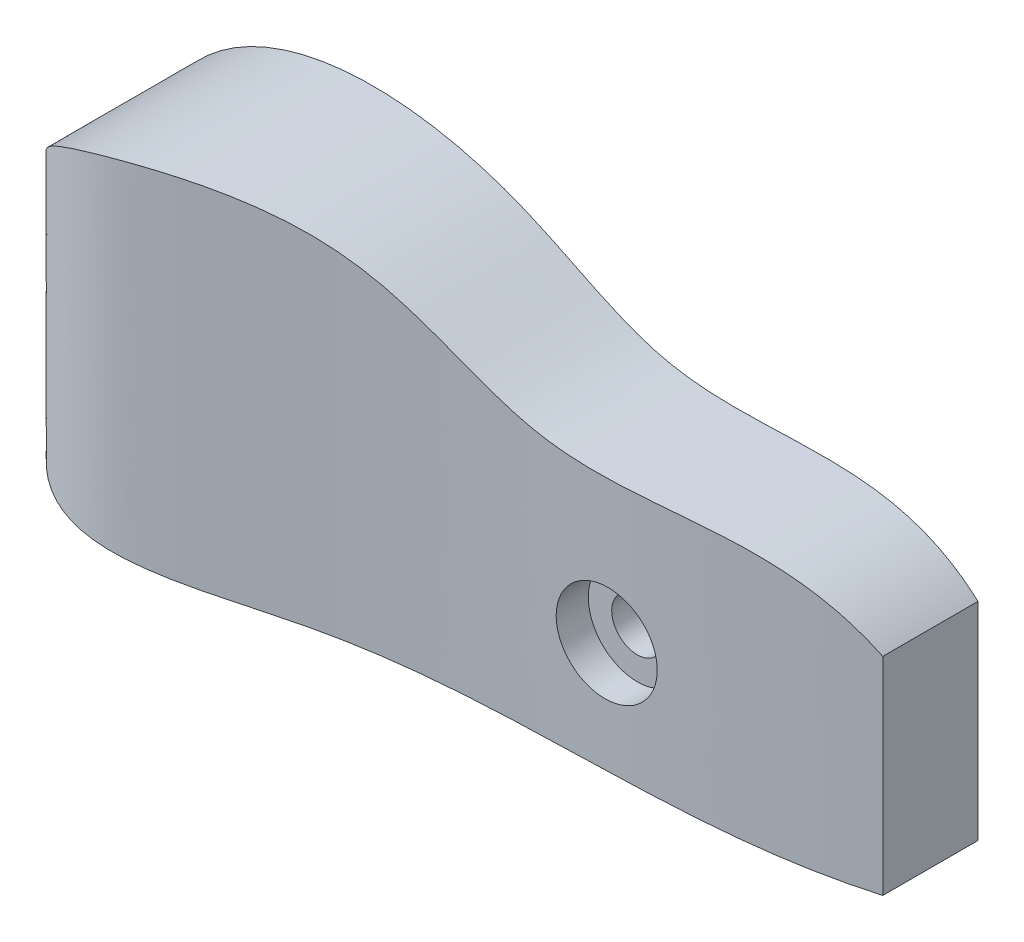
ISO-10303-21;
HEADER;
FILE_DESCRIPTION(('STEP AP214'),'2;1');
FILE_NAME('part.step','',(''),(''),'','','');
FILE_SCHEMA(('AUTOMOTIVE_DESIGN { 1 0 10303 214 1 1 1 1 }'));
ENDSEC;
DATA;
#1=APPLICATION_CONTEXT('core data for automotive mechanical design processes');
#2=APPLICATION_PROTOCOL_DEFINITION('international standard','automotive_design',2000,#1);
#3=PRODUCT_CONTEXT('',#1,'mechanical');
#4=PRODUCT('Part','Part','',(#3));
#5=PRODUCT_RELATED_PRODUCT_CATEGORY('part','',(#4));
#6=PRODUCT_DEFINITION_FORMATION('','',#4);
#7=PRODUCT_DEFINITION_CONTEXT('part definition',#1,'design');
#8=PRODUCT_DEFINITION('design','',#6,#7);
#9=PRODUCT_DEFINITION_SHAPE('','',#8);
#10=(LENGTH_UNIT() NAMED_UNIT(*) SI_UNIT(.MILLI.,.METRE.));
#11=(NAMED_UNIT(*) PLANE_ANGLE_UNIT() SI_UNIT($,.RADIAN.));
#12=(NAMED_UNIT(*) SI_UNIT($,.STERADIAN.) SOLID_ANGLE_UNIT());
#13=UNCERTAINTY_MEASURE_WITH_UNIT(LENGTH_MEASURE(1.E-05),#10,'distance_accuracy_value','');
#14=(GEOMETRIC_REPRESENTATION_CONTEXT(3) GLOBAL_UNCERTAINTY_ASSIGNED_CONTEXT((#13)) GLOBAL_UNIT_ASSIGNED_CONTEXT((#10,
#11,#12)) REPRESENTATION_CONTEXT('',''));
#15=CARTESIAN_POINT('',(0.,0.,0.));
#16=DIRECTION('',(0.,0.,1.));
#17=DIRECTION('',(1.,0.,0.));
#18=AXIS2_PLACEMENT_3D('',#15,#16,#17);
#19=CARTESIAN_POINT('',(0.,0.,8.27));
#20=DIRECTION('',(1.,0.,0.));
#21=DIRECTION('',(0.,0.,-1.));
#22=AXIS2_PLACEMENT_3D('',#19,#20,#21);
#23=PLANE('',#22);
#24=DIRECTION('',(0.,0.,-1.));
#25=VECTOR('',#24,1.);
#26=CARTESIAN_POINT('',(0.,12.7,8.27));
#27=LINE('',#26,#25);
#28=CARTESIAN_POINT('',(0.,12.7,8.26999999999997));
#29=VERTEX_POINT('',#28);
#30=CARTESIAN_POINT('',(0.,12.7,2.42899999999999));
#31=VERTEX_POINT('',#30);
#32=EDGE_CURVE('E205',#29,#31,#27,.T.);
#33=ORIENTED_EDGE('',*,*,#32,.T.);
#34=DIRECTION('',(0.,-1.,0.));
#35=VECTOR('',#34,1.);
#36=CARTESIAN_POINT('',(0.,0.,2.429));
#37=LINE('',#36,#35);
#38=CARTESIAN_POINT('',(0.,0.,2.429));
#39=VERTEX_POINT('',#38);
#40=EDGE_CURVE('E239',#31,#39,#37,.T.);
#41=ORIENTED_EDGE('',*,*,#40,.T.);
#42=DIRECTION('',(0.,0.,-1.));
#43=VECTOR('',#42,1.);
#44=CARTESIAN_POINT('',(0.,0.,8.27));
#45=LINE('',#44,#43);
#46=CARTESIAN_POINT('',(0.,0.,8.27));
#47=VERTEX_POINT('',#46);
#48=EDGE_CURVE('E12',#47,#39,#45,.T.);
#49=ORIENTED_EDGE('',*,*,#48,.F.);
#50=DIRECTION('',(0.,-1.,0.));
#51=VECTOR('',#50,1.);
#52=CARTESIAN_POINT('',(0.,0.,8.27));
#53=LINE('',#52,#51);
#54=EDGE_CURVE('E196',#29,#47,#53,.T.);
#55=ORIENTED_EDGE('',*,*,#54,.F.);
#56=EDGE_LOOP('',(#33,#41,#49,#55));
#57=FACE_BOUND('',#56,.T.);
#58=ADVANCED_FACE('F36',(#57),#23,.F.);
#59=CARTESIAN_POINT('',(0.,0.,8.27));
#60=DIRECTION('',(0.,1.,0.));
#61=DIRECTION('',(0.,0.,1.));
#62=AXIS2_PLACEMENT_3D('',#59,#60,#61);
#63=PLANE('',#62);
#64=ORIENTED_EDGE('',*,*,#48,.T.);
#65=DIRECTION('',(1.,0.,0.));
#66=VECTOR('',#65,1.);
#67=CARTESIAN_POINT('',(0.,0.,2.429));
#68=LINE('',#67,#66);
#69=CARTESIAN_POINT('',(50.8,0.,2.42899999999997));
#70=VERTEX_POINT('',#69);
#71=EDGE_CURVE('E174',#39,#70,#68,.T.);
#72=ORIENTED_EDGE('',*,*,#71,.T.);
#73=DIRECTION('',(0.,0.,-1.));
#74=VECTOR('',#73,1.);
#75=CARTESIAN_POINT('',(50.8,0.,8.27));
#76=LINE('',#75,#74);
#77=CARTESIAN_POINT('',(50.8,0.,8.27));
#78=VERTEX_POINT('',#77);
#79=EDGE_CURVE('E48',#78,#70,#76,.T.);
#80=ORIENTED_EDGE('',*,*,#79,.F.);
#81=CARTESIAN_POINT('',(50.8,0.,8.27));
#82=CARTESIAN_POINT('',(40.3890490974301,0.,11.2429268355869));
#83=CARTESIAN_POINT('',(22.7858334747671,0.,7.80620814335379));
#84=CARTESIAN_POINT('',(5.40228852193754,0.,16.6408518779961));
#85=CARTESIAN_POINT('',(0.,0.,8.27));
#86=B_SPLINE_CURVE_WITH_KNOTS('',3,(#81,#82,#83,#84,#85),.UNSPECIFIED.,.F.,.F.,(4,1,4),(0.,
0.604228209606289,1.),.UNSPECIFIED.);
#87=EDGE_CURVE('E173',#78,#47,#86,.T.);
#88=ORIENTED_EDGE('',*,*,#87,.T.);
#89=EDGE_LOOP('',(#64,#72,#80,#88));
#90=FACE_BOUND('',#89,.T.);
#91=ADVANCED_FACE('F247',(#90),#63,.F.);
#92=CARTESIAN_POINT('',(50.8,0.,8.27));
#93=DIRECTION('',(-1.,0.,0.));
#94=DIRECTION('',(0.,-1.,0.));
#95=AXIS2_PLACEMENT_3D('',#92,#93,#94);
#96=PLANE('',#95);
#97=ORIENTED_EDGE('',*,*,#79,.T.);
#98=DIRECTION('',(0.,1.,0.));
#99=VECTOR('',#98,1.);
#100=CARTESIAN_POINT('',(50.8,0.,2.42899999999997));
#101=LINE('',#100,#99);
#102=CARTESIAN_POINT('',(50.8,12.7,2.42899999999997));
#103=VERTEX_POINT('',#102);
#104=EDGE_CURVE('E165',#70,#103,#101,.T.);
#105=ORIENTED_EDGE('',*,*,#104,.T.);
#106=DIRECTION('',(0.,0.,-1.));
#107=VECTOR('',#106,1.);
#108=CARTESIAN_POINT('',(50.8,12.7,8.27));
#109=LINE('',#108,#107);
#110=CARTESIAN_POINT('',(50.8,12.7,8.27));
#111=VERTEX_POINT('',#110);
#112=EDGE_CURVE('E64',#111,#103,#109,.T.);
#113=ORIENTED_EDGE('',*,*,#112,.F.);
#114=DIRECTION('',(0.,1.,0.));
#115=VECTOR('',#114,1.);
#116=CARTESIAN_POINT('',(50.8,0.,8.27));
#117=LINE('',#116,#115);
#118=EDGE_CURVE('E202',#78,#111,#117,.T.);
#119=ORIENTED_EDGE('',*,*,#118,.F.);
#120=EDGE_LOOP('',(#97,#105,#113,#119));
#121=FACE_BOUND('',#120,.T.);
#122=ADVANCED_FACE('F187',(#121),#96,.F.);
#123=CARTESIAN_POINT('',(50.8,12.7,-46.1811076361008));
#124=CARTESIAN_POINT('',(45.2725282832761,17.7104243626633,-46.1811076361008));
#125=CARTESIAN_POINT('',(34.142821947375,12.9602209766849,-46.1811076361008));
#126=CARTESIAN_POINT('',(18.3731743229189,23.3828411954333,-46.1811076361008));
#127=CARTESIAN_POINT('',(3.43666909169114,22.2703524696661,-46.1811076361008));
#128=CARTESIAN_POINT('',(0.,12.7,-46.1811076361008));
#129=B_SPLINE_CURVE_WITH_KNOTS('',3,(#123,#124,#125,#126,#127,#128),.UNSPECIFIED.,.F.,.F.,(4,1,
1,4),(0.,0.358140923879692,0.531313138547449,1.),.UNSPECIFIED.);
#130=DIRECTION('',(0.,0.,1.));
#131=VECTOR('',#130,1.);
#132=SURFACE_OF_LINEAR_EXTRUSION('',#129,#131);
#133=ORIENTED_EDGE('',*,*,#112,.T.);
#134=CARTESIAN_POINT('',(0.,12.7,2.42899999999999));
#135=CARTESIAN_POINT('',(3.43666909169114,22.2703524696661,2.42899999999999));
#136=CARTESIAN_POINT('',(18.3731743229189,23.3828411954333,2.42899999999999));
#137=CARTESIAN_POINT('',(34.142821947375,12.9602209766849,2.42899999999999));
#138=CARTESIAN_POINT('',(45.2725282832761,17.7104243626633,2.42899999999999));
#139=CARTESIAN_POINT('',(50.8,12.7,2.42899999999999));
#140=B_SPLINE_CURVE_WITH_KNOTS('',3,(#134,#135,#136,#137,#138,#139),.UNSPECIFIED.,.F.,.F.,(4,1,
1,4),(0.,0.468686861452551,0.641859076120308,1.),.UNSPECIFIED.);
#141=EDGE_CURVE('E233',#103,#31,#140,.F.);
#142=ORIENTED_EDGE('',*,*,#141,.T.);
#143=ORIENTED_EDGE('',*,*,#32,.F.);
#144=CARTESIAN_POINT('',(50.8,12.7,8.27));
#145=CARTESIAN_POINT('',(50.6788276822437,12.8098521864383,8.30460285476997));
#146=CARTESIAN_POINT('',(50.5552404770921,12.9170578182335,8.33920026274339));
#147=CARTESIAN_POINT('',(50.3033250460581,13.1258365135867,8.4082336135925));
#148=CARTESIAN_POINT('',(50.1749961664896,13.2274087956687,8.44266953346249));
#149=CARTESIAN_POINT('',(49.9137230114803,13.4245482618124,8.51121881429451));
#150=CARTESIAN_POINT('',(49.7807788518938,13.5201155964435,8.54533218332601));
#151=CARTESIAN_POINT('',(49.5104611781958,13.7049397145617,8.61307116164984));
#152=CARTESIAN_POINT('',(49.3730878758097,13.7941967990474,8.64669679414629));
#153=CARTESIAN_POINT('',(49.098637405636,13.9633873643859,8.71222384341057));
#154=CARTESIAN_POINT('',(48.9616931735949,14.0435285354899,8.74414591360659));
#155=CARTESIAN_POINT('',(48.6841547403304,14.197501982547,8.80722959171404));
#156=CARTESIAN_POINT('',(48.5435609872719,14.2713350284103,8.83839129209639));
#157=CARTESIAN_POINT('',(48.259027688436,14.4126030786113,8.89981620014018));
#158=CARTESIAN_POINT('',(48.115088567062,14.4800388890648,8.93007952067539));
#159=CARTESIAN_POINT('',(47.8242060016342,14.6084949848182,8.9895805323196));
#160=CARTESIAN_POINT('',(47.677263167202,14.6695165567834,9.01881842833672));
#161=CARTESIAN_POINT('',(47.3799503886503,14.7855092391141,9.07630921553981));
#162=CARTESIAN_POINT('',(47.2295670140226,14.840448678557,9.1045564712557));
#163=CARTESIAN_POINT('',(46.9264228291705,14.944067231382,9.15982374722799));
#164=CARTESIAN_POINT('',(46.7736617766962,14.9927457021219,9.18684364132094));
#165=CARTESIAN_POINT('',(46.4660864358868,15.0840507741714,9.23958937153274));
#166=CARTESIAN_POINT('',(46.3112716877044,15.1266759941941,9.26531491143185));
#167=CARTESIAN_POINT('',(45.9999294763925,15.2061297951786,9.31542010233444));
#168=CARTESIAN_POINT('',(45.8434017984105,15.2429576398539,9.33979958212879));
#169=CARTESIAN_POINT('',(45.5271491327203,15.3115125383955,9.387453174524));
#170=CARTESIAN_POINT('',(45.3674080654358,15.3431762313602,9.41071139845356));
#171=CARTESIAN_POINT('',(45.0468014429892,15.4012412208448,9.45580688578308));
#172=CARTESIAN_POINT('',(44.8859360467165,15.4276432459759,9.47764434564137));
#173=CARTESIAN_POINT('',(44.5633300387219,15.4755736863728,9.51990670317805));
#174=CARTESIAN_POINT('',(44.4015895904526,15.497102981691,9.54033185546651));
#175=CARTESIAN_POINT('',(44.0774909851307,15.5356886732869,9.57978945034016));
#176=CARTESIAN_POINT('',(43.9151331485466,15.5527471347246,9.59882253300831));
#177=CARTESIAN_POINT('',(43.2401476968385,15.6151573642939,9.67502289141134));
#178=CARTESIAN_POINT('',(42.7251380710509,15.6424612406336,9.72617326551385));
#179=CARTESIAN_POINT('',(41.6925631473261,15.6698478007036,9.81685831148063));
#180=CARTESIAN_POINT('',(41.1749947061198,15.6698690705466,9.85636657694553));
#181=CARTESIAN_POINT('',(40.138563529192,15.6548681528755,9.92588008752061));
#182=CARTESIAN_POINT('',(39.6197001846979,15.6398177948621,9.95586739870421));
#183=CARTESIAN_POINT('',(38.5821523825063,15.6063939817031,10.0085107845482));
#184=CARTESIAN_POINT('',(38.0634680989105,15.5880231168575,10.0311725356626));
#185=CARTESIAN_POINT('',(37.0277371024506,15.5596992879247,10.0714055778535));
#186=CARTESIAN_POINT('',(36.5106922631208,15.5497125391941,10.0889971097109));
#187=CARTESIAN_POINT('',(35.4795820199739,15.5502644488179,10.121347837864));
#188=CARTESIAN_POINT('',(34.9655185398666,15.560673204329,10.1361243062165));
#189=CARTESIAN_POINT('',(34.1963204331591,15.6013913933152,10.1578609834715));
#190=CARTESIAN_POINT('',(33.9405459507244,15.6191116997497,10.1650267823893));
#191=CARTESIAN_POINT('',(33.429869296785,15.6646579984036,10.1794801162701));
#192=CARTESIAN_POINT('',(33.1749671624592,15.6924844160562,10.1867676563457));
#193=CARTESIAN_POINT('',(32.6671205857169,15.7599770172441,10.2016970281903));
#194=CARTESIAN_POINT('',(32.4141736416487,15.7996239562262,10.2093382671631));
#195=CARTESIAN_POINT('',(32.0366766586385,15.8692589671692,10.2212362587058));
#196=CARTESIAN_POINT('',(31.9111710687212,15.8941632534549,10.2252747340155));
#197=CARTESIAN_POINT('',(31.6609359478063,15.9475896561211,10.23352121397));
#198=CARTESIAN_POINT('',(31.5362063999236,15.9761116934963,10.2377292149113));
#199=CARTESIAN_POINT('',(31.2874802712164,16.0368963853661,10.246343429876));
#200=CARTESIAN_POINT('',(31.1634850012488,16.0691643562999,10.2507499200458));
#201=CARTESIAN_POINT('',(30.9164369531804,16.1370945150655,10.2597797504311));
#202=CARTESIAN_POINT('',(30.7933841985017,16.1727567869541,10.2644030960154));
#203=CARTESIAN_POINT('',(30.4256313815943,16.2844543650455,10.2786347654642));
#204=CARTESIAN_POINT('',(30.1823673607308,16.3651928248877,10.2886036743884));
#205=CARTESIAN_POINT('',(29.4552392941207,16.6239157273878,10.3203533540347));
#206=CARTESIAN_POINT('',(28.9770867603176,16.8176091706416,10.343876092112));
#207=CARTESIAN_POINT('',(28.0301759929236,17.2304870307678,10.3971036965957));
#208=CARTESIAN_POINT('',(27.5614687250318,17.4497805108269,10.4268354729699));
#209=CARTESIAN_POINT('',(26.6306213363117,17.8976494928033,10.4939714041429));
#210=CARTESIAN_POINT('',(26.1684674521427,18.126199737705,10.5313556792818));
#211=CARTESIAN_POINT('',(25.4921947649634,18.457888333023,10.5931061083704));
#212=CARTESIAN_POINT('',(25.2783782683086,18.5623566588429,10.613657812378));
#213=CARTESIAN_POINT('',(24.8506977813895,18.769020846748,10.6569953072986));
#214=CARTESIAN_POINT('',(24.6368360174947,18.8712227782449,10.6797739332509));
#215=CARTESIAN_POINT('',(24.2084130663559,19.0722413513674,10.7278031445019));
#216=CARTESIAN_POINT('',(23.9938546838682,19.1710653499677,10.7530478251122));
#217=CARTESIAN_POINT('',(23.5634041232122,19.3642628083571,10.8062783216902));
#218=CARTESIAN_POINT('',(23.3475140303483,19.4586418619099,10.834260548197));
#219=CARTESIAN_POINT('',(23.0222410985067,19.5961037958833,10.8785129610028));
#220=CARTESIAN_POINT('',(22.9135705413426,19.6412426047006,10.8936445946641));
#221=CARTESIAN_POINT('',(22.6957196401168,19.7299898531444,10.9247029163356));
#222=CARTESIAN_POINT('',(22.5865392973038,19.7735982965175,10.9406296023991));
#223=CARTESIAN_POINT('',(22.2581541516956,19.9020992717126,10.9896616828956));
#224=CARTESIAN_POINT('',(22.038202131774,19.98462636671,11.0240059731484));
#225=CARTESIAN_POINT('',(21.5962574037323,20.1435237520605,11.0962598347246));
#226=CARTESIAN_POINT('',(21.3742619632501,20.2198838339506,11.1341751012696));
#227=CARTESIAN_POINT('',(20.9286400696205,20.3663423347341,11.2137676610703));
#228=CARTESIAN_POINT('',(20.7050122586425,20.43643468987,11.2554485206737));
#229=CARTESIAN_POINT('',(20.2565430094159,20.5702676494304,11.3427435547443));
#230=CARTESIAN_POINT('',(20.0317011979725,20.6340061678332,11.3883590118671));
#231=CARTESIAN_POINT('',(19.5812247852994,20.7550432777485,11.4837027498055));
#232=CARTESIAN_POINT('',(19.355590410988,20.8123435786651,11.5334299328054));
#233=CARTESIAN_POINT('',(18.8466318730722,20.9341448140412,11.6501906755516));
#234=CARTESIAN_POINT('',(18.5631405893614,20.9968052679512,11.7184217399099));
#235=CARTESIAN_POINT('',(17.9954160028194,21.1119239377996,11.8595689270704));
#236=CARTESIAN_POINT('',(17.7111831091203,21.1643869124013,11.9324828433792));
#237=CARTESIAN_POINT('',(17.1417585250214,21.2590442088372,12.0812460026737));
#238=CARTESIAN_POINT('',(16.8565667707544,21.3012378323454,12.157095444872));
#239=CARTESIAN_POINT('',(16.2849808635891,21.3751659326142,12.3099189731498));
#240=CARTESIAN_POINT('',(15.9985861972931,21.406895357148,12.3868935837978));
#241=CARTESIAN_POINT('',(15.4230388929598,21.459688361629,12.5404425677476));
#242=CARTESIAN_POINT('',(15.1338797050668,21.4806936918091,12.617012565464));
#243=CARTESIAN_POINT('',(14.5542204522157,21.5113205113191,12.7672904411617));
#244=CARTESIAN_POINT('',(14.2637204593859,21.5209426060057,12.8409984711399));
#245=CARTESIAN_POINT('',(13.6814950405729,21.5282002090707,12.9833307976228));
#246=CARTESIAN_POINT('',(13.3897704736742,21.5258430520176,13.0519581787587));
#247=CARTESIAN_POINT('',(12.8051781939073,21.5084194230258,13.1817854023831));
#248=CARTESIAN_POINT('',(12.5123111553717,21.4933595694817,13.2429890937931));
#249=CARTESIAN_POINT('',(11.926175325209,21.4497125448396,13.3553540625502));
#250=CARTESIAN_POINT('',(11.6329082448801,21.4211501358914,13.4065334812666));
#251=CARTESIAN_POINT('',(11.0461763885327,21.3495715024389,13.4962713048507));
#252=CARTESIAN_POINT('',(10.7527116323951,21.3065565624094,13.5348308307158));
#253=CARTESIAN_POINT('',(10.1680172782234,21.205369451203,13.5964120728929));
#254=CARTESIAN_POINT('',(9.87678348842636,21.1472628795126,13.6194995245092));
#255=CARTESIAN_POINT('',(9.29699746287959,21.0150319262851,13.6477450584036));
#256=CARTESIAN_POINT('',(9.00844518744414,20.9409077821987,13.6529034064502));
#257=CARTESIAN_POINT('',(8.52907203311122,20.8029176732457,13.6446699563286));
#258=CARTESIAN_POINT('',(8.33685920146672,20.7435016756034,13.6367438260302));
#259=CARTESIAN_POINT('',(7.95554054766343,20.61715134819,13.6111952931936));
#260=CARTESIAN_POINT('',(7.76643489837419,20.5502166017224,13.5935723530374));
#261=CARTESIAN_POINT('',(7.39223895887229,20.4089472719651,13.5483384119875));
#262=CARTESIAN_POINT('',(7.20714832631996,20.3346133226116,13.5207282662273));
#263=CARTESIAN_POINT('',(6.84171744971604,20.1787233932003,13.4554529345528));
#264=CARTESIAN_POINT('',(6.66137992037828,20.0971633972256,13.4177821336488));
#265=CARTESIAN_POINT('',(6.30633474917265,19.9271800921297,13.3325883378804));
#266=CARTESIAN_POINT('',(6.131627625234,19.8387561541445,13.2850644396222));
#267=CARTESIAN_POINT('',(5.788558831338,19.6554814069112,13.1806164420511));
#268=CARTESIAN_POINT('',(5.62019628984871,19.5606314854218,13.1236936396549));
#269=CARTESIAN_POINT('',(5.23986610352069,19.335026336934,12.9823214362492));
#270=CARTESIAN_POINT('',(5.03029517227303,19.2021561750286,12.8947758608768));
#271=CARTESIAN_POINT('',(4.62347000989407,18.9272132719992,12.7064759895346));
#272=CARTESIAN_POINT('',(4.42621895540165,18.7851381764962,12.6057183074552));
#273=CARTESIAN_POINT('',(4.04408702514155,18.492579054145,12.3928950749123));
#274=CARTESIAN_POINT('',(3.85922023121155,18.3420858002659,12.2808170034949));
#275=CARTESIAN_POINT('',(3.50195968342154,18.0336071313258,12.0475117433593));
#276=CARTESIAN_POINT('',(3.32956748194907,17.8756207878309,11.9262834197696));
#277=CARTESIAN_POINT('',(2.87939375163146,17.4387238768072,11.5885515078168));
#278=CARTESIAN_POINT('',(2.61312941024337,17.1531836120856,11.3652057090647));
#279=CARTESIAN_POINT('',(2.11298178394293,16.5634991857168,10.9068861212369));
#280=CARTESIAN_POINT('',(1.87912470806406,16.2593402497059,10.6719031267565));
#281=CARTESIAN_POINT('',(1.44105686452583,15.6327169608587,10.198626289789));
#282=CARTESIAN_POINT('',(1.23685382127784,15.3102478688323,9.96033160230605));
#283=CARTESIAN_POINT('',(0.855969202761422,14.6466191019315,9.48834310113397));
#284=CARTESIAN_POINT('',(0.679268412242821,14.3054727038165,9.25464617572013));
#285=CARTESIAN_POINT('',(0.420987979934452,13.7518251779484,8.89566537282129));
#286=CARTESIAN_POINT('',(0.330783369906625,13.545931552897,8.7663287053995));
#287=CARTESIAN_POINT('',(0.159027677003279,13.1278456920365,8.51350489034959));
#288=CARTESIAN_POINT('',(0.0774559290316303,12.9156701285128,8.39000418430645));
#289=CARTESIAN_POINT('',(0.,12.7,8.27));
#290=B_SPLINE_CURVE_WITH_KNOTS('',3,(#144,#145,#146,#147,#148,#149,#150,#151,#152,#153,#154,
#155,#156,#157,#158,#159,#160,#161,#162,#163,#164,#165,#166,#167,#168,#169,#170,#171,#172,#173,
#174,#175,#176,#177,#178,#179,#180,#181,#182,#183,#184,#185,#186,#187,#188,#189,#190,#191,#192,
#193,#194,#195,#196,#197,#198,#199,#200,#201,#202,#203,#204,#205,#206,#207,#208,#209,#210,#211,
#212,#213,#214,#215,#216,#217,#218,#219,#220,#221,#222,#223,#224,#225,#226,#227,#228,#229,#230,
#231,#232,#233,#234,#235,#236,#237,#238,#239,#240,#241,#242,#243,#244,#245,#246,#247,#248,#249,
#250,#251,#252,#253,#254,#255,#256,#257,#258,#259,#260,#261,#262,#263,#264,#265,#266,#267,#268,
#269,#270,#271,#272,#273,#274,#275,#276,#277,#278,#279,#280,#281,#282,#283,#284,#285,#286,#287,
#288,#289),.UNSPECIFIED.,.F.,.F.,(4,2,2,2,2,2,2,2,2,2,2,2,2,2,2,2,2,2,2,2,2,2,2,2,2,2,2,2,2,2,2,
2,2,2,2,2,2,2,2,2,2,2,2,2,2,2,2,2,2,2,2,2,2,2,2,2,2,2,2,2,2,2,2,2,2,2,2,2,2,2,2,2,4),(0.,
0.501502896572543,1.00307519007473,1.50463490201228,2.00617067341525,2.49155481437487,
2.97687962905117,3.46214320647698,3.94730925585429,4.43489334590043,4.92252744298411,
5.4102726347531,5.89807972194476,6.39148275444861,6.88481741525487,7.37806290480431,
7.87108015206252,9.42436631602572,10.9811489631556,12.5408468462691,14.0993332322225,
15.6515089783819,17.1938307522702,17.9631300298514,18.7324616960947,19.5005476186687,
19.8845525614042,20.2685491195904,20.6530974881307,21.0376553821408,21.8068656789751,
23.3547041911717,24.9093956819797,26.4600985154361,27.1766631658356,27.8909937873664,
28.6036541005316,29.3153921902987,29.6713042796366,30.0272154975923,30.7393559876019,
31.4526521244755,32.1666310429105,32.8808436003279,33.5948660775727,34.4893561160382,
35.3834277324636,36.2775601296856,37.1721235937277,38.0714956752512,38.9708199263145,
39.8695936120807,40.767899305306,41.6645639612293,42.5611489467702,43.453900096021,
44.3466380116901,44.9503094472908,45.5540143554861,46.1576675849403,46.761658428165,
47.365704673572,47.969667638639,48.758189732334,49.5469143115143,50.3365210190114,
51.1262258198989,52.4734368823457,53.8217312070523,55.17037611376,56.5180744791427,
57.2958357467883,58.0716909871225),.UNSPECIFIED.);
#291=EDGE_CURVE('E166',#111,#29,#290,.T.);
#292=ORIENTED_EDGE('',*,*,#291,.F.);
#293=EDGE_LOOP('',(#133,#142,#143,#292));
#294=FACE_BOUND('',#293,.T.);
#295=ADVANCED_FACE('F182',(#294),#132,.T.);
#296=CARTESIAN_POINT('',(50.8,23.3838411954333,8.27));
#297=CARTESIAN_POINT('',(40.3890490974301,23.3838411954333,11.2429268355869));
#298=CARTESIAN_POINT('',(22.7858334747671,23.3838411954333,7.80620814335379));
#299=CARTESIAN_POINT('',(5.40228852193754,23.3838411954333,16.6408518779961));
#300=CARTESIAN_POINT('',(0.,23.3838411954333,8.27));
#301=B_SPLINE_CURVE_WITH_KNOTS('',3,(#296,#297,#298,#299,#300),.UNSPECIFIED.,.F.,.F.,(4,1,4),
(0.,0.604228209606289,1.),.UNSPECIFIED.);
#302=DIRECTION('',(0.,-1.,0.));
#303=VECTOR('',#302,1.);
#304=SURFACE_OF_LINEAR_EXTRUSION('',#301,#303);
#305=CARTESIAN_POINT('',(32.7011194753767,6.78050945075627,10.2007517381976));
#306=CARTESIAN_POINT('',(32.7011269523581,6.6120506066758,10.2007514137567));
#307=CARTESIAN_POINT('',(32.7153563745698,6.44346971328317,10.2003251777973));
#308=CARTESIAN_POINT('',(32.7719216885611,6.11095204301377,10.1986396502716));
#309=CARTESIAN_POINT('',(32.8142913787879,5.94702109823247,10.1973793569501));
#310=CARTESIAN_POINT('',(32.9259274072895,5.62866970089738,10.1940854902591));
#311=CARTESIAN_POINT('',(32.9951806225856,5.47424465066244,10.192052294186));
#312=CARTESIAN_POINT('',(33.1585968459491,5.1792577729853,10.187298976367));
#313=CARTESIAN_POINT('',(33.2527536962277,5.03869253028137,10.1845790244392));
#314=CARTESIAN_POINT('',(33.4633439480305,4.77531694270208,10.1785473383465));
#315=CARTESIAN_POINT('',(33.5797845062325,4.65251232416915,10.1752354140852));
#316=CARTESIAN_POINT('',(33.8316204799855,4.42818914800809,10.1681116909302));
#317=CARTESIAN_POINT('',(33.9670166686128,4.32667145895644,10.1642998716493));
#318=CARTESIAN_POINT('',(34.2529682634146,4.1477710532934,10.1562509888458));
#319=CARTESIAN_POINT('',(34.4035290985691,4.07039702108472,10.1520137730319));
#320=CARTESIAN_POINT('',(34.715493662857,3.94202531617903,10.1431734494317));
#321=CARTESIAN_POINT('',(34.8768973872019,3.89102763183344,10.138570341807));
#322=CARTESIAN_POINT('',(35.2060185879513,3.81683939322335,10.1290439335436));
#323=CARTESIAN_POINT('',(35.3737380505807,3.79365766335753,10.1241205318161));
#324=CARTESIAN_POINT('',(35.710679846654,3.77578466950963,10.1140057272544));
#325=CARTESIAN_POINT('',(35.879902179577,3.78109339565228,10.1088143245133));
#326=CARTESIAN_POINT('',(36.2150896173448,3.82005189176985,10.0982351051003));
#327=CARTESIAN_POINT('',(36.3810538879276,3.85370882619217,10.0928472391057));
#328=CARTESIAN_POINT('',(36.704970857224,3.94841561556648,10.0819885139368));
#329=CARTESIAN_POINT('',(36.8629235328451,4.00946554947039,10.0765176545233));
#330=CARTESIAN_POINT('',(37.1663617058931,4.15723895615758,10.065653820785));
#331=CARTESIAN_POINT('',(37.3118450260963,4.24396690074623,10.060260860198));
#332=CARTESIAN_POINT('',(37.5861837073226,4.44063386904178,10.0497650276672));
#333=CARTESIAN_POINT('',(37.7150390642926,4.55057289840637,10.0446621557941));
#334=CARTESIAN_POINT('',(37.9524477032408,4.79053355593391,10.0349947807222));
#335=CARTESIAN_POINT('',(38.0610031982809,4.92055299213457,10.0304302188577));
#336=CARTESIAN_POINT('',(38.2547400205601,5.19699733721303,10.0220988887866));
#337=CARTESIAN_POINT('',(38.3399214297267,5.34342218858641,10.0183321177837));
#338=CARTESIAN_POINT('',(38.4844322183968,5.64841936967191,10.0118394295974));
#339=CARTESIAN_POINT('',(38.543778716613,5.80698357344544,10.0091128233292));
#340=CARTESIAN_POINT('',(38.6350063193723,6.13184072654799,10.0048853442811));
#341=CARTESIAN_POINT('',(38.6668876028155,6.29813362552719,10.003384463517));
#342=CARTESIAN_POINT('',(38.7022557211497,6.63355847196294,10.0017178556962));
#343=CARTESIAN_POINT('',(38.7057694990661,6.80268757257013,10.0015508617356));
#344=CARTESIAN_POINT('',(38.6843730543517,7.13913369920718,10.0025609643244));
#345=CARTESIAN_POINT('',(38.6594629080983,7.30645073010499,10.0037380572623));
#346=CARTESIAN_POINT('',(38.5819447704719,7.63446257734068,10.0073500293387));
#347=CARTESIAN_POINT('',(38.5293466528373,7.79515973236305,10.0097844600954));
#348=CARTESIAN_POINT('',(38.3979581996839,8.10544177746322,10.0157406433729));
#349=CARTESIAN_POINT('',(38.3191677778874,8.25502663093498,10.0192623994754));
#350=CARTESIAN_POINT('',(38.1375779042381,8.53894165368101,10.0271661847565));
#351=CARTESIAN_POINT('',(38.0347634015487,8.67326218128171,10.0315487529493));
#352=CARTESIAN_POINT('',(37.8080717288254,8.9227419208904,10.0409154321659));
#353=CARTESIAN_POINT('',(37.684194442596,9.03790102718495,10.0458995465082));
#354=CARTESIAN_POINT('',(37.4187629853039,9.24590124618487,10.0562217447746));
#355=CARTESIAN_POINT('',(37.2771923303967,9.33872130789307,10.0615601565726));
#356=CARTESIAN_POINT('',(36.9804813352022,9.49927519346352,10.0723649060567));
#357=CARTESIAN_POINT('',(36.8253409722916,9.56700897550087,10.0778312439562));
#358=CARTESIAN_POINT('',(36.5058115299523,9.67549674878647,10.0887198285768));
#359=CARTESIAN_POINT('',(36.3414180012075,9.71623763836426,10.0941420526268));
#360=CARTESIAN_POINT('',(36.0081176474543,9.76952842789144,10.1048154878767));
#361=CARTESIAN_POINT('',(35.8392108128308,9.78207826777871,10.1100666987122));
#362=CARTESIAN_POINT('',(35.501683041806,9.77862702380346,10.1203165143131));
#363=CARTESIAN_POINT('',(35.3330621023424,9.76262624771117,10.1253151218009));
#364=CARTESIAN_POINT('',(35.0008951672191,9.70252461791174,10.1350050615476));
#365=CARTESIAN_POINT('',(34.8373491780763,9.65842372812129,10.1396963934118));
#366=CARTESIAN_POINT('',(34.5200112113552,9.54338161416284,10.1487242971575));
#367=CARTESIAN_POINT('',(34.3662173984482,9.47244545791635,10.1530609358358));
#368=CARTESIAN_POINT('',(34.0727272127624,9.30574572916666,10.1613257627126));
#369=CARTESIAN_POINT('',(33.9330302731811,9.20998315542926,10.1652539673334));
#370=CARTESIAN_POINT('',(33.671747854571,8.9963873259441,10.1726292140464));
#371=CARTESIAN_POINT('',(33.5501556481815,8.87856230509054,10.1760764348327));
#372=CARTESIAN_POINT('',(33.3284487225431,8.62412251145513,10.1824038272746));
#373=CARTESIAN_POINT('',(33.2283393085054,8.48750311100814,10.1852838588475));
#374=CARTESIAN_POINT('',(33.0524755592377,8.19937813009666,10.1903793782825));
#375=CARTESIAN_POINT('',(32.9767245817566,8.04787050108242,10.1925947745234));
#376=CARTESIAN_POINT('',(32.8518217242397,7.73439814268162,10.1962680783868));
#377=CARTESIAN_POINT('',(32.8026379022843,7.57244623409369,10.1977268955664));
#378=CARTESIAN_POINT('',(32.7453770162231,7.30463592099391,10.1994300631256));
#379=CARTESIAN_POINT('',(32.7288012183757,7.20051964516946,10.1999246973676));
#380=CARTESIAN_POINT('',(32.7066701119093,6.99112130109741,10.200585636289));
#381=CARTESIAN_POINT('',(32.7011148003545,6.88583923316037,10.2007519410559));
#382=CARTESIAN_POINT('',(32.7011194753767,6.78050945075627,10.2007517381976));
#383=B_SPLINE_CURVE_WITH_KNOTS('',3,(#305,#306,#307,#308,#309,#310,#311,#312,#313,#314,#315,
#316,#317,#318,#319,#320,#321,#322,#323,#324,#325,#326,#327,#328,#329,#330,#331,#332,#333,#334,
#335,#336,#337,#338,#339,#340,#341,#342,#343,#344,#345,#346,#347,#348,#349,#350,#351,#352,#353,
#354,#355,#356,#357,#358,#359,#360,#361,#362,#363,#364,#365,#366,#367,#368,#369,#370,#371,#372,
#373,#374,#375,#376,#377,#378,#379,#380,#381,#382),.UNSPECIFIED.,.T.,.F.,(4,2,2,2,2,2,2,2,2,2,2,
2,2,2,2,2,2,2,2,2,2,2,2,2,2,2,2,2,2,2,2,2,2,2,2,2,2,2,4),(0.,0.504991995260963,1.01059162104664,
1.51594475212307,2.0211730438578,2.52656386879617,3.03197531132574,3.53756833986768,
4.04316114512473,4.54891430345904,5.0546672864909,5.56054812692477,6.06643042541435,
6.57240087477958,7.0783714474752,7.58428682778619,8.09020043481337,8.59577830151913,
9.10135287501836,9.60644720491895,10.1115401775953,10.6164531522241,11.1213677900583,
11.6265996038084,12.131834204827,12.6375430611183,13.1432527605446,13.6492077392583,
14.1551637959279,14.6611143985202,15.1670656508042,15.6729214003202,16.1787568024364,
16.6844037745259,17.1901754736424,17.6960168622539,18.2012487120006,18.5169977095494,
18.8327466229828),.UNSPECIFIED.);
#384=CARTESIAN_POINT('',(32.7011194753767,6.78050945075627,10.2007517381976));
#385=VERTEX_POINT('',#384);
#386=EDGE_CURVE('E39',#385,#385,#383,.T.);
#387=ORIENTED_EDGE('',*,*,#386,.F.);
#388=EDGE_LOOP('',(#387));
#389=FACE_BOUND('',#388,.T.);
#390=ORIENTED_EDGE('',*,*,#118,.T.);
#391=ORIENTED_EDGE('',*,*,#291,.T.);
#392=ORIENTED_EDGE('',*,*,#54,.T.);
#393=ORIENTED_EDGE('',*,*,#87,.F.);
#394=EDGE_LOOP('',(#390,#391,#392,#393));
#395=FACE_BOUND('',#394,.T.);
#396=ADVANCED_FACE('F179',(#389,#395),#304,.T.);
#397=CARTESIAN_POINT('',(35.7011194753767,6.78050945075625,-54.3831370934326));
#398=DIRECTION('',(0.,0.,1.));
#399=DIRECTION('',(1.,0.,0.));
#400=AXIS2_PLACEMENT_3D('',#397,#398,#399);
#401=CYLINDRICAL_SURFACE('',#400,4.67665);
#402=DIRECTION('',(0.,0.,1.));
#403=VECTOR('',#402,1.);
#404=CARTESIAN_POINT('',(32.8897438905052,10.5177841989235,-54.3831370934326));
#405=LINE('',#404,#403);
#406=CARTESIAN_POINT('',(32.8897438905052,10.5177841989235,2.42899999999998));
#407=VERTEX_POINT('',#406);
#408=CARTESIAN_POINT('',(32.8897438905052,10.5177841989235,5.73));
#409=VERTEX_POINT('',#408);
#410=EDGE_CURVE('E136',#407,#409,#405,.T.);
#411=ORIENTED_EDGE('',*,*,#410,.F.);
#412=CARTESIAN_POINT('',(35.7011194753767,6.78050945075625,2.42899999999998));
#413=DIRECTION('',(0.,0.,1.));
#414=DIRECTION('',(1.,0.,0.));
#415=AXIS2_PLACEMENT_3D('',#412,#413,#414);
#416=CIRCLE('',#415,4.67665);
#417=CARTESIAN_POINT('',(32.9510131645885,2.99792164584507,2.42899999999998));
#418=VERTEX_POINT('',#417);
#419=EDGE_CURVE('E130',#407,#418,#416,.F.);
#420=ORIENTED_EDGE('',*,*,#419,.T.);
#421=DIRECTION('',(0.,0.,1.));
#422=VECTOR('',#421,1.);
#423=CARTESIAN_POINT('',(32.9510131645885,2.99792164584507,-54.3831370934326));
#424=LINE('',#423,#422);
#425=CARTESIAN_POINT('',(32.9510131645885,2.99792164584507,5.73));
#426=VERTEX_POINT('',#425);
#427=EDGE_CURVE('E156',#418,#426,#424,.T.);
#428=ORIENTED_EDGE('',*,*,#427,.T.);
#429=CARTESIAN_POINT('',(35.7011194753767,6.78050945075625,5.73));
#430=DIRECTION('',(0.,0.,-1.));
#431=DIRECTION('',(-1.,0.,0.));
#432=AXIS2_PLACEMENT_3D('',#429,#430,#431);
#433=CIRCLE('',#432,4.67665);
#434=EDGE_CURVE('E56',#426,#409,#433,.F.);
#435=ORIENTED_EDGE('',*,*,#434,.T.);
#436=EDGE_LOOP('',(#411,#420,#428,#435));
#437=FACE_BOUND('',#436,.T.);
#438=ADVANCED_FACE('F259',(#437),#401,.F.);
#439=CARTESIAN_POINT('',(0.228472523201563,4.61714699032178,-54.3831370934326));
#440=DIRECTION('',(-0.0494230128854718,-0.99877793617867,0.));
#441=DIRECTION('',(0.99877793617867,-0.0494230128854718,0.));
#442=AXIS2_PLACEMENT_3D('',#439,#440,#441);
#443=PLANE('',#442);
#444=ORIENTED_EDGE('',*,*,#427,.F.);
#445=DIRECTION('',(-0.99877793617867,0.0494230128854718,0.));
#446=VECTOR('',#445,1.);
#447=CARTESIAN_POINT('',(0.228472523201598,4.61714699032177,2.429));
#448=LINE('',#447,#446);
#449=CARTESIAN_POINT('',(21.6192253523073,3.55865799651434,2.42899999999999));
#450=VERTEX_POINT('',#449);
#451=EDGE_CURVE('E221',#418,#450,#448,.T.);
#452=ORIENTED_EDGE('',*,*,#451,.T.);
#453=DIRECTION('',(0.,0.,1.));
#454=VECTOR('',#453,1.);
#455=CARTESIAN_POINT('',(21.6192253523073,3.55865799651434,-54.3831370934326));
#456=LINE('',#455,#454);
#457=CARTESIAN_POINT('',(21.6192253523073,3.55865799651434,5.73));
#458=VERTEX_POINT('',#457);
#459=EDGE_CURVE('E158',#450,#458,#456,.T.);
#460=ORIENTED_EDGE('',*,*,#459,.T.);
#461=DIRECTION('',(0.99877793617867,-0.0494230128854718,0.));
#462=VECTOR('',#461,1.);
#463=CARTESIAN_POINT('',(0.228472523201563,4.61714699032178,5.73));
#464=LINE('',#463,#462);
#465=EDGE_CURVE('E151',#458,#426,#464,.T.);
#466=ORIENTED_EDGE('',*,*,#465,.T.);
#467=EDGE_LOOP('',(#444,#452,#460,#466));
#468=FACE_BOUND('',#467,.T.);
#469=ADVANCED_FACE('F264',(#468),#443,.F.);
#470=CARTESIAN_POINT('',(21.7674943909637,6.55499180505034,-54.3831370934326));
#471=DIRECTION('',(0.,0.,1.));
#472=DIRECTION('',(1.,0.,0.));
#473=AXIS2_PLACEMENT_3D('',#470,#471,#472);
#474=CYLINDRICAL_SURFACE('',#473,3.);
#475=ORIENTED_EDGE('',*,*,#459,.F.);
#476=CARTESIAN_POINT('',(21.7674943909637,6.55499180505034,2.42899999999999));
#477=DIRECTION('',(0.,0.,1.));
#478=DIRECTION('',(1.,0.,0.));
#479=AXIS2_PLACEMENT_3D('',#476,#477,#478);
#480=CIRCLE('',#479,3.);
#481=CARTESIAN_POINT('',(18.7675939625214,6.53054964001403,2.42899999999999));
#482=VERTEX_POINT('',#481);
#483=EDGE_CURVE('E224',#450,#482,#480,.F.);
#484=ORIENTED_EDGE('',*,*,#483,.T.);
#485=DIRECTION('',(0.,0.,1.));
#486=VECTOR('',#485,1.);
#487=CARTESIAN_POINT('',(18.7675939625214,6.53054964001403,-54.3831370934326));
#488=LINE('',#487,#486);
#489=CARTESIAN_POINT('',(18.7675939625214,6.53054964001403,5.73));
#490=VERTEX_POINT('',#489);
#491=EDGE_CURVE('E160',#482,#490,#488,.T.);
#492=ORIENTED_EDGE('',*,*,#491,.T.);
#493=CARTESIAN_POINT('',(21.7674943909637,6.55499180505034,5.73));
#494=DIRECTION('',(0.,0.,-1.));
#495=DIRECTION('',(-1.,0.,0.));
#496=AXIS2_PLACEMENT_3D('',#493,#494,#495);
#497=CIRCLE('',#496,3.);
#498=EDGE_CURVE('E145',#490,#458,#497,.F.);
#499=ORIENTED_EDGE('',*,*,#498,.T.);
#500=EDGE_LOOP('',(#475,#484,#492,#499));
#501=FACE_BOUND('',#500,.T.);
#502=ADVANCED_FACE('F296',(#501),#474,.F.);
#503=CARTESIAN_POINT('',(18.8195533288802,0.153335298736174,-54.3831370934326));
#504=DIRECTION('',(-0.999966809480769,-0.00814738834543404,0.));
#505=DIRECTION('',(0.00814738834543404,-0.999966809480769,0.));
#506=AXIS2_PLACEMENT_3D('',#503,#504,#505);
#507=PLANE('',#506);
#508=ORIENTED_EDGE('',*,*,#491,.F.);
#509=DIRECTION('',(-0.00814738834543404,0.999966809480769,0.));
#510=VECTOR('',#509,1.);
#511=CARTESIAN_POINT('',(18.8195533288802,0.153335298736154,2.42899999999999));
#512=LINE('',#511,#510);
#513=CARTESIAN_POINT('',(18.7657691511184,6.75451721823844,2.42899999999999));
#514=VERTEX_POINT('',#513);
#515=EDGE_CURVE('E227',#482,#514,#512,.T.);
#516=ORIENTED_EDGE('',*,*,#515,.T.);
#517=DIRECTION('',(0.,0.,1.));
#518=VECTOR('',#517,1.);
#519=CARTESIAN_POINT('',(18.7657691511184,6.75451721823844,-54.3831370934326));
#520=LINE('',#519,#518);
#521=CARTESIAN_POINT('',(18.7657691511184,6.75451721823844,5.73));
#522=VERTEX_POINT('',#521);
#523=EDGE_CURVE('E131',#514,#522,#520,.T.);
#524=ORIENTED_EDGE('',*,*,#523,.T.);
#525=DIRECTION('',(0.00814738834543404,-0.999966809480769,0.));
#526=VECTOR('',#525,1.);
#527=CARTESIAN_POINT('',(18.8195533288802,0.153335298736174,5.73));
#528=LINE('',#527,#526);
#529=EDGE_CURVE('E143',#522,#490,#528,.T.);
#530=ORIENTED_EDGE('',*,*,#529,.T.);
#531=EDGE_LOOP('',(#508,#516,#524,#530));
#532=FACE_BOUND('',#531,.T.);
#533=ADVANCED_FACE('F306',(#532),#507,.F.);
#534=CARTESIAN_POINT('',(21.7656695795607,6.77895938327476,-54.3831370934326));
#535=DIRECTION('',(0.,0.,1.));
#536=DIRECTION('',(1.,0.,0.));
#537=AXIS2_PLACEMENT_3D('',#534,#535,#536);
#538=CYLINDRICAL_SURFACE('',#537,3.);
#539=ORIENTED_EDGE('',*,*,#523,.F.);
#540=CARTESIAN_POINT('',(21.7656695795607,6.77895938327476,2.42899999999999));
#541=DIRECTION('',(0.,0.,1.));
#542=DIRECTION('',(1.,0.,0.));
#543=AXIS2_PLACEMENT_3D('',#540,#541,#542);
#544=CIRCLE('',#543,3.);
#545=CARTESIAN_POINT('',(21.5685972552952,9.77247946822635,2.42899999999999));
#546=VERTEX_POINT('',#545);
#547=EDGE_CURVE('E127',#514,#546,#544,.F.);
#548=ORIENTED_EDGE('',*,*,#547,.T.);
#549=DIRECTION('',(0.,0.,1.));
#550=VECTOR('',#549,1.);
#551=CARTESIAN_POINT('',(21.5685972552952,9.77247946822635,-54.3831370934326));
#552=LINE('',#551,#550);
#553=CARTESIAN_POINT('',(21.5685972552952,9.77247946822635,5.73));
#554=VERTEX_POINT('',#553);
#555=EDGE_CURVE('E120',#546,#554,#552,.T.);
#556=ORIENTED_EDGE('',*,*,#555,.T.);
#557=CARTESIAN_POINT('',(21.7656695795607,6.77895938327476,5.73));
#558=DIRECTION('',(0.,0.,-1.));
#559=DIRECTION('',(-1.,0.,0.));
#560=AXIS2_PLACEMENT_3D('',#557,#558,#559);
#561=CIRCLE('',#560,3.);
#562=EDGE_CURVE('E125',#554,#522,#561,.F.);
#563=ORIENTED_EDGE('',*,*,#562,.T.);
#564=EDGE_LOOP('',(#539,#548,#556,#563));
#565=FACE_BOUND('',#564,.T.);
#566=ADVANCED_FACE('F123',(#565),#538,.F.);
#567=CARTESIAN_POINT('',(-0.547500637541057,8.31651101244936,-54.3831370934326));
#568=DIRECTION('',(-0.065690774755164,0.997840028317198,0.));
#569=DIRECTION('',(-0.997840028317198,-0.065690774755164,0.));
#570=AXIS2_PLACEMENT_3D('',#567,#568,#569);
#571=PLANE('',#570);
#572=ORIENTED_EDGE('',*,*,#555,.F.);
#573=DIRECTION('',(0.997840028317198,0.065690774755164,0.));
#574=VECTOR('',#573,1.);
#575=CARTESIAN_POINT('',(-0.547500637541025,8.31651101244936,2.429));
#576=LINE('',#575,#574);
#577=EDGE_CURVE('E231',#546,#407,#576,.T.);
#578=ORIENTED_EDGE('',*,*,#577,.T.);
#579=ORIENTED_EDGE('',*,*,#410,.T.);
#580=DIRECTION('',(-0.997840028317198,-0.065690774755164,0.));
#581=VECTOR('',#580,1.);
#582=CARTESIAN_POINT('',(-0.547500637541057,8.31651101244936,5.73));
#583=LINE('',#582,#581);
#584=EDGE_CURVE('E134',#409,#554,#583,.T.);
#585=ORIENTED_EDGE('',*,*,#584,.T.);
#586=EDGE_LOOP('',(#572,#578,#579,#585));
#587=FACE_BOUND('',#586,.T.);
#588=ADVANCED_FACE('F135',(#587),#571,.F.);
#589=CARTESIAN_POINT('',(35.7011194753767,6.78050945075627,2.42899999999998));
#590=DIRECTION('',(0.,0.,1.));
#591=DIRECTION('',(0.00814738834543946,-0.999966809480769,0.));
#592=AXIS2_PLACEMENT_3D('',#589,#590,#591);
#593=PLANE('',#592);
#594=ORIENTED_EDGE('',*,*,#547,.F.);
#595=ORIENTED_EDGE('',*,*,#515,.F.);
#596=ORIENTED_EDGE('',*,*,#483,.F.);
#597=ORIENTED_EDGE('',*,*,#451,.F.);
#598=ORIENTED_EDGE('',*,*,#419,.F.);
#599=ORIENTED_EDGE('',*,*,#577,.F.);
#600=EDGE_LOOP('',(#594,#595,#596,#597,#598,#599));
#601=FACE_BOUND('',#600,.T.);
#602=ORIENTED_EDGE('',*,*,#40,.F.);
#603=ORIENTED_EDGE('',*,*,#141,.F.);
#604=ORIENTED_EDGE('',*,*,#104,.F.);
#605=ORIENTED_EDGE('',*,*,#71,.F.);
#606=EDGE_LOOP('',(#602,#603,#604,#605));
#607=FACE_BOUND('',#606,.T.);
#608=ADVANCED_FACE('F252',(#601,#607),#593,.F.);
#609=CARTESIAN_POINT('',(0.,0.,5.73));
#610=DIRECTION('',(0.,0.,-1.));
#611=DIRECTION('',(-1.,0.,0.));
#612=AXIS2_PLACEMENT_3D('',#609,#610,#611);
#613=PLANE('',#612);
#614=CARTESIAN_POINT('',(35.7011194753767,6.78050945075627,5.73));
#615=DIRECTION('',(0.,0.,-1.));
#616=DIRECTION('',(-1.,0.,0.));
#617=AXIS2_PLACEMENT_3D('',#614,#615,#616);
#618=CIRCLE('',#617,1.565);
#619=CARTESIAN_POINT('',(34.1361194753767,6.78050945075627,5.73));
#620=VERTEX_POINT('',#619);
#621=EDGE_CURVE('E138',#620,#620,#618,.T.);
#622=ORIENTED_EDGE('',*,*,#621,.F.);
#623=EDGE_LOOP('',(#622));
#624=FACE_BOUND('',#623,.T.);
#625=ORIENTED_EDGE('',*,*,#584,.F.);
#626=ORIENTED_EDGE('',*,*,#434,.F.);
#627=ORIENTED_EDGE('',*,*,#465,.F.);
#628=ORIENTED_EDGE('',*,*,#498,.F.);
#629=ORIENTED_EDGE('',*,*,#529,.F.);
#630=ORIENTED_EDGE('',*,*,#562,.F.);
#631=EDGE_LOOP('',(#625,#626,#627,#628,#629,#630));
#632=FACE_BOUND('',#631,.T.);
#633=ADVANCED_FACE('F140',(#624,#632),#613,.T.);
#634=CARTESIAN_POINT('',(35.7011194753767,6.78050945075627,19.1142397317995));
#635=DIRECTION('',(0.,0.,-1.));
#636=DIRECTION('',(-1.,0.,0.));
#637=AXIS2_PLACEMENT_3D('',#634,#635,#636);
#638=CYLINDRICAL_SURFACE('',#637,1.565);
#639=CARTESIAN_POINT('',(35.7011194753767,6.78050945075627,8.23000008));
#640=DIRECTION('',(0.,0.,-1.));
#641=DIRECTION('',(-1.,0.,0.));
#642=AXIS2_PLACEMENT_3D('',#639,#640,#641);
#643=CIRCLE('',#642,1.565);
#644=CARTESIAN_POINT('',(34.1361194753767,6.78050945075627,8.23000008));
#645=VERTEX_POINT('',#644);
#646=EDGE_CURVE('E208',#645,#645,#643,.F.);
#647=ORIENTED_EDGE('',*,*,#646,.T.);
#648=EDGE_LOOP('',(#647));
#649=FACE_BOUND('',#648,.T.);
#650=ORIENTED_EDGE('',*,*,#621,.T.);
#651=EDGE_LOOP('',(#650));
#652=FACE_BOUND('',#651,.T.);
#653=ADVANCED_FACE('F349',(#649,#652),#638,.F.);
#654=CARTESIAN_POINT('',(35.7011194753767,6.78050945075627,8.23000008));
#655=DIRECTION('',(0.,0.,-1.));
#656=DIRECTION('',(-1.,0.,0.));
#657=AXIS2_PLACEMENT_3D('',#654,#655,#656);
#658=PLANE('',#657);
#659=CARTESIAN_POINT('',(35.7011194753767,6.78050945075627,8.23000008));
#660=DIRECTION('',(0.,0.,-1.));
#661=DIRECTION('',(-1.,0.,0.));
#662=AXIS2_PLACEMENT_3D('',#659,#660,#661);
#663=CIRCLE('',#662,3.);
#664=CARTESIAN_POINT('',(32.7011194753767,6.78050945075627,8.23000008));
#665=VERTEX_POINT('',#664);
#666=EDGE_CURVE('E210',#665,#665,#663,.T.);
#667=ORIENTED_EDGE('',*,*,#666,.F.);
#668=EDGE_LOOP('',(#667));
#669=FACE_BOUND('',#668,.T.);
#670=ORIENTED_EDGE('',*,*,#646,.F.);
#671=EDGE_LOOP('',(#670));
#672=FACE_BOUND('',#671,.T.);
#673=ADVANCED_FACE('F365',(#669,#672),#658,.F.);
#674=CARTESIAN_POINT('',(35.7011194753767,6.78050945075627,10.77000008));
#675=DIRECTION('',(0.,0.,-1.));
#676=DIRECTION('',(-1.,0.,0.));
#677=AXIS2_PLACEMENT_3D('',#674,#675,#676);
#678=CYLINDRICAL_SURFACE('',#677,3.);
#679=ORIENTED_EDGE('',*,*,#386,.T.);
#680=EDGE_LOOP('',(#679));
#681=FACE_BOUND('',#680,.T.);
#682=ORIENTED_EDGE('',*,*,#666,.T.);
#683=EDGE_LOOP('',(#682));
#684=FACE_BOUND('',#683,.T.);
#685=ADVANCED_FACE('F374',(#681,#684),#678,.F.);
#686=CLOSED_SHELL('',(#58,#91,#122,#295,#396,#438,#469,#502,#533,#566,#588,#608,#633,#653,#673,#685));
#687=MANIFOLD_SOLID_BREP('B2',#686);
#688=ADVANCED_BREP_SHAPE_REPRESENTATION('',(#18,#687),#14);
#689=SHAPE_DEFINITION_REPRESENTATION(#9,#688);
ENDSEC;
END-ISO-10303-21;
